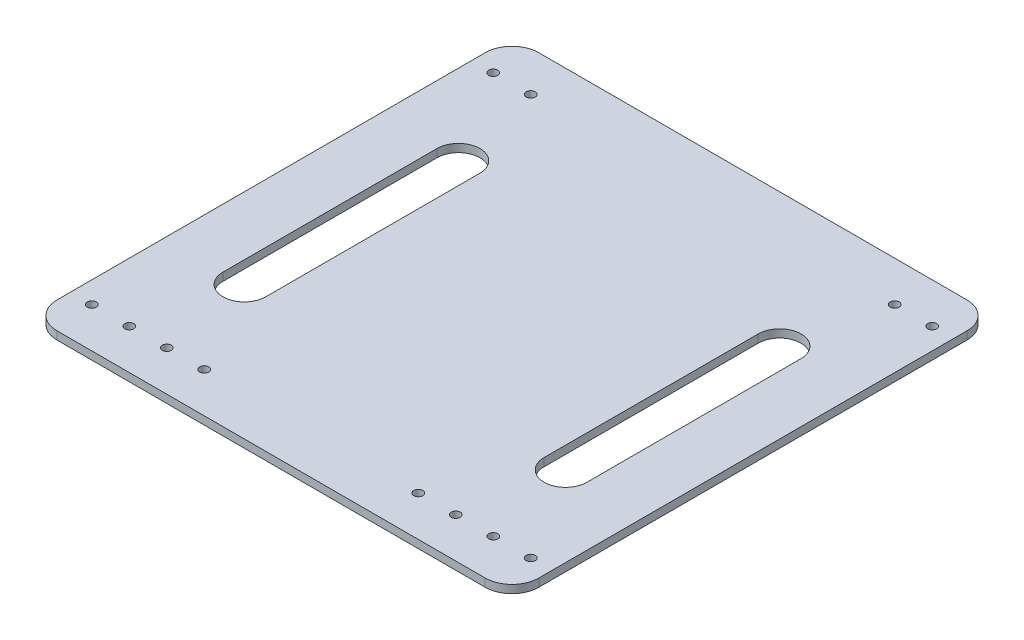
ISO-10303-21;
HEADER;
FILE_DESCRIPTION(('STEP AP214'),'2;1');
FILE_NAME('part.step','',(''),(''),'','','');
FILE_SCHEMA(('AUTOMOTIVE_DESIGN { 1 0 10303 214 1 1 1 1 }'));
ENDSEC;
DATA;
#1=APPLICATION_CONTEXT('core data for automotive mechanical design processes');
#2=APPLICATION_PROTOCOL_DEFINITION('international standard','automotive_design',2000,#1);
#3=PRODUCT_CONTEXT('',#1,'mechanical');
#4=PRODUCT('Part','Part','',(#3));
#5=PRODUCT_RELATED_PRODUCT_CATEGORY('part','',(#4));
#6=PRODUCT_DEFINITION_FORMATION('','',#4);
#7=PRODUCT_DEFINITION_CONTEXT('part definition',#1,'design');
#8=PRODUCT_DEFINITION('design','',#6,#7);
#9=PRODUCT_DEFINITION_SHAPE('','',#8);
#10=(LENGTH_UNIT() NAMED_UNIT(*) SI_UNIT(.MILLI.,.METRE.));
#11=(NAMED_UNIT(*) PLANE_ANGLE_UNIT() SI_UNIT($,.RADIAN.));
#12=(NAMED_UNIT(*) SI_UNIT($,.STERADIAN.) SOLID_ANGLE_UNIT());
#13=UNCERTAINTY_MEASURE_WITH_UNIT(LENGTH_MEASURE(1.E-05),#10,'distance_accuracy_value','');
#14=(GEOMETRIC_REPRESENTATION_CONTEXT(3) GLOBAL_UNCERTAINTY_ASSIGNED_CONTEXT((#13)) GLOBAL_UNIT_ASSIGNED_CONTEXT((#10,
#11,#12)) REPRESENTATION_CONTEXT('',''));
#15=CARTESIAN_POINT('',(0.,0.,0.));
#16=DIRECTION('',(0.,0.,1.));
#17=DIRECTION('',(1.,0.,0.));
#18=AXIS2_PLACEMENT_3D('',#15,#16,#17);
#19=CARTESIAN_POINT('',(90.,3.,-90.));
#20=DIRECTION('',(-1.,0.,0.));
#21=DIRECTION('',(0.,0.,1.));
#22=AXIS2_PLACEMENT_3D('',#19,#20,#21);
#23=PLANE('',#22);
#24=DIRECTION('',(0.,0.,-1.));
#25=VECTOR('',#24,1.);
#26=CARTESIAN_POINT('',(90.,0.,-90.));
#27=LINE('',#26,#25);
#28=CARTESIAN_POINT('',(90.,0.,79.9999999999999));
#29=VERTEX_POINT('',#28);
#30=CARTESIAN_POINT('',(90.,0.,-80.));
#31=VERTEX_POINT('',#30);
#32=EDGE_CURVE('E286',#29,#31,#27,.T.);
#33=ORIENTED_EDGE('',*,*,#32,.T.);
#34=DIRECTION('',(0.,-1.,0.));
#35=VECTOR('',#34,1.);
#36=CARTESIAN_POINT('',(90.,3.,-80.));
#37=LINE('',#36,#35);
#38=CARTESIAN_POINT('',(90.,3.,-80.));
#39=VERTEX_POINT('',#38);
#40=EDGE_CURVE('E11',#31,#39,#37,.F.);
#41=ORIENTED_EDGE('',*,*,#40,.T.);
#42=DIRECTION('',(0.,0.,-1.));
#43=VECTOR('',#42,1.);
#44=CARTESIAN_POINT('',(90.,3.,-90.));
#45=LINE('',#44,#43);
#46=CARTESIAN_POINT('',(90.,3.,79.9999999999999));
#47=VERTEX_POINT('',#46);
#48=EDGE_CURVE('E287',#47,#39,#45,.T.);
#49=ORIENTED_EDGE('',*,*,#48,.F.);
#50=DIRECTION('',(0.,-1.,0.));
#51=VECTOR('',#50,1.);
#52=CARTESIAN_POINT('',(90.,3.,80.));
#53=LINE('',#52,#51);
#54=EDGE_CURVE('E41',#47,#29,#53,.T.);
#55=ORIENTED_EDGE('',*,*,#54,.T.);
#56=EDGE_LOOP('',(#33,#41,#49,#55));
#57=FACE_BOUND('',#56,.T.);
#58=ADVANCED_FACE('F33',(#57),#23,.F.);
#59=CARTESIAN_POINT('',(-90.,3.,-90.));
#60=DIRECTION('',(0.,0.,1.));
#61=DIRECTION('',(1.,0.,0.));
#62=AXIS2_PLACEMENT_3D('',#59,#60,#61);
#63=PLANE('',#62);
#64=DIRECTION('',(-1.,0.,0.));
#65=VECTOR('',#64,1.);
#66=CARTESIAN_POINT('',(-90.,0.,-90.));
#67=LINE('',#66,#65);
#68=CARTESIAN_POINT('',(79.9999999999999,0.,-90.));
#69=VERTEX_POINT('',#68);
#70=CARTESIAN_POINT('',(-80.,0.,-90.));
#71=VERTEX_POINT('',#70);
#72=EDGE_CURVE('E303',#69,#71,#67,.T.);
#73=ORIENTED_EDGE('',*,*,#72,.T.);
#74=DIRECTION('',(0.,-1.,0.));
#75=VECTOR('',#74,1.);
#76=CARTESIAN_POINT('',(-80.,3.,-90.));
#77=LINE('',#76,#75);
#78=CARTESIAN_POINT('',(-80.,3.,-90.));
#79=VERTEX_POINT('',#78);
#80=EDGE_CURVE('E326',#71,#79,#77,.F.);
#81=ORIENTED_EDGE('',*,*,#80,.T.);
#82=DIRECTION('',(-1.,0.,0.));
#83=VECTOR('',#82,1.);
#84=CARTESIAN_POINT('',(-90.,3.,-90.));
#85=LINE('',#84,#83);
#86=CARTESIAN_POINT('',(79.9999999999999,3.,-90.));
#87=VERTEX_POINT('',#86);
#88=EDGE_CURVE('E290',#87,#79,#85,.T.);
#89=ORIENTED_EDGE('',*,*,#88,.F.);
#90=DIRECTION('',(0.,-1.,0.));
#91=VECTOR('',#90,1.);
#92=CARTESIAN_POINT('',(80.,3.,-90.));
#93=LINE('',#92,#91);
#94=EDGE_CURVE('E323',#87,#69,#93,.T.);
#95=ORIENTED_EDGE('',*,*,#94,.T.);
#96=EDGE_LOOP('',(#73,#81,#89,#95));
#97=FACE_BOUND('',#96,.T.);
#98=ADVANCED_FACE('F358',(#97),#63,.F.);
#99=CARTESIAN_POINT('',(-90.,3.,-90.));
#100=DIRECTION('',(1.,0.,0.));
#101=DIRECTION('',(0.,0.,-1.));
#102=AXIS2_PLACEMENT_3D('',#99,#100,#101);
#103=PLANE('',#102);
#104=DIRECTION('',(0.,0.,1.));
#105=VECTOR('',#104,1.);
#106=CARTESIAN_POINT('',(-90.,3.,-90.));
#107=LINE('',#106,#105);
#108=CARTESIAN_POINT('',(-90.,3.,-80.));
#109=VERTEX_POINT('',#108);
#110=CARTESIAN_POINT('',(-90.,3.,79.9999999999999));
#111=VERTEX_POINT('',#110);
#112=EDGE_CURVE('E294',#109,#111,#107,.T.);
#113=ORIENTED_EDGE('',*,*,#112,.F.);
#114=DIRECTION('',(0.,-1.,0.));
#115=VECTOR('',#114,1.);
#116=CARTESIAN_POINT('',(-90.,3.,-80.));
#117=LINE('',#116,#115);
#118=CARTESIAN_POINT('',(-90.,0.,-80.));
#119=VERTEX_POINT('',#118);
#120=EDGE_CURVE('E312',#109,#119,#117,.T.);
#121=ORIENTED_EDGE('',*,*,#120,.T.);
#122=DIRECTION('',(0.,0.,1.));
#123=VECTOR('',#122,1.);
#124=CARTESIAN_POINT('',(-90.,0.,-90.));
#125=LINE('',#124,#123);
#126=CARTESIAN_POINT('',(-90.,0.,79.9999999999999));
#127=VERTEX_POINT('',#126);
#128=EDGE_CURVE('E306',#119,#127,#125,.T.);
#129=ORIENTED_EDGE('',*,*,#128,.T.);
#130=DIRECTION('',(0.,-1.,0.));
#131=VECTOR('',#130,1.);
#132=CARTESIAN_POINT('',(-90.,3.,80.));
#133=LINE('',#132,#131);
#134=EDGE_CURVE('E300',#127,#111,#133,.F.);
#135=ORIENTED_EDGE('',*,*,#134,.T.);
#136=EDGE_LOOP('',(#113,#121,#129,#135));
#137=FACE_BOUND('',#136,.T.);
#138=ADVANCED_FACE('F368',(#137),#103,.F.);
#139=CARTESIAN_POINT('',(-90.,3.,90.));
#140=DIRECTION('',(0.,0.,-1.));
#141=DIRECTION('',(-1.,0.,0.));
#142=AXIS2_PLACEMENT_3D('',#139,#140,#141);
#143=PLANE('',#142);
#144=DIRECTION('',(1.,0.,0.));
#145=VECTOR('',#144,1.);
#146=CARTESIAN_POINT('',(-90.,3.,90.));
#147=LINE('',#146,#145);
#148=CARTESIAN_POINT('',(-80.,3.,90.));
#149=VERTEX_POINT('',#148);
#150=CARTESIAN_POINT('',(79.9999999999999,3.,90.));
#151=VERTEX_POINT('',#150);
#152=EDGE_CURVE('E297',#149,#151,#147,.T.);
#153=ORIENTED_EDGE('',*,*,#152,.F.);
#154=DIRECTION('',(0.,-1.,0.));
#155=VECTOR('',#154,1.);
#156=CARTESIAN_POINT('',(-80.,3.,90.));
#157=LINE('',#156,#155);
#158=CARTESIAN_POINT('',(-80.,0.,90.));
#159=VERTEX_POINT('',#158);
#160=EDGE_CURVE('E338',#149,#159,#157,.T.);
#161=ORIENTED_EDGE('',*,*,#160,.T.);
#162=DIRECTION('',(1.,0.,0.));
#163=VECTOR('',#162,1.);
#164=CARTESIAN_POINT('',(-90.,0.,90.));
#165=LINE('',#164,#163);
#166=CARTESIAN_POINT('',(79.9999999999999,0.,90.));
#167=VERTEX_POINT('',#166);
#168=EDGE_CURVE('E291',#159,#167,#165,.T.);
#169=ORIENTED_EDGE('',*,*,#168,.T.);
#170=DIRECTION('',(0.,-1.,0.));
#171=VECTOR('',#170,1.);
#172=CARTESIAN_POINT('',(80.,3.,90.));
#173=LINE('',#172,#171);
#174=EDGE_CURVE('E336',#167,#151,#173,.F.);
#175=ORIENTED_EDGE('',*,*,#174,.T.);
#176=EDGE_LOOP('',(#153,#161,#169,#175));
#177=FACE_BOUND('',#176,.T.);
#178=ADVANCED_FACE('F376',(#177),#143,.F.);
#179=CARTESIAN_POINT('',(0.,3.,0.));
#180=DIRECTION('',(0.,1.,0.));
#181=DIRECTION('',(0.,0.,1.));
#182=AXIS2_PLACEMENT_3D('',#179,#180,#181);
#183=PLANE('',#182);
#184=CARTESIAN_POINT('',(-60.,3.,-40.));
#185=DIRECTION('',(0.,1.,0.));
#186=DIRECTION('',(0.,0.,1.));
#187=AXIS2_PLACEMENT_3D('',#184,#185,#186);
#188=CIRCLE('',#187,8.);
#189=CARTESIAN_POINT('',(-52.,3.,-40.));
#190=VERTEX_POINT('',#189);
#191=CARTESIAN_POINT('',(-68.,3.,-40.));
#192=VERTEX_POINT('',#191);
#193=EDGE_CURVE('E48',#190,#192,#188,.T.);
#194=ORIENTED_EDGE('',*,*,#193,.F.);
#195=DIRECTION('',(0.,0.,-1.));
#196=VECTOR('',#195,1.);
#197=CARTESIAN_POINT('',(-52.,3.,-40.));
#198=LINE('',#197,#196);
#199=CARTESIAN_POINT('',(-52.,3.,40.));
#200=VERTEX_POINT('',#199);
#201=EDGE_CURVE('E166',#200,#190,#198,.T.);
#202=ORIENTED_EDGE('',*,*,#201,.F.);
#203=CARTESIAN_POINT('',(-60.,3.,40.));
#204=DIRECTION('',(0.,1.,0.));
#205=DIRECTION('',(0.,0.,1.));
#206=AXIS2_PLACEMENT_3D('',#203,#204,#205);
#207=CIRCLE('',#206,8.);
#208=CARTESIAN_POINT('',(-68.,3.,40.));
#209=VERTEX_POINT('',#208);
#210=EDGE_CURVE('E169',#209,#200,#207,.T.);
#211=ORIENTED_EDGE('',*,*,#210,.F.);
#212=DIRECTION('',(0.,0.,1.));
#213=VECTOR('',#212,1.);
#214=CARTESIAN_POINT('',(-68.,3.,-40.));
#215=LINE('',#214,#213);
#216=EDGE_CURVE('E175',#192,#209,#215,.T.);
#217=ORIENTED_EDGE('',*,*,#216,.F.);
#218=EDGE_LOOP('',(#194,#202,#211,#217));
#219=FACE_BOUND('',#218,.T.);
#220=CARTESIAN_POINT('',(60.,3.,-40.));
#221=DIRECTION('',(0.,1.,0.));
#222=DIRECTION('',(0.,0.,1.));
#223=AXIS2_PLACEMENT_3D('',#220,#221,#222);
#224=CIRCLE('',#223,8.00000000000001);
#225=CARTESIAN_POINT('',(68.,3.,-40.));
#226=VERTEX_POINT('',#225);
#227=CARTESIAN_POINT('',(52.,3.,-40.));
#228=VERTEX_POINT('',#227);
#229=EDGE_CURVE('E56',#226,#228,#224,.T.);
#230=ORIENTED_EDGE('',*,*,#229,.F.);
#231=DIRECTION('',(0.,0.,-1.));
#232=VECTOR('',#231,1.);
#233=CARTESIAN_POINT('',(68.,3.,-40.));
#234=LINE('',#233,#232);
#235=CARTESIAN_POINT('',(68.,3.,40.));
#236=VERTEX_POINT('',#235);
#237=EDGE_CURVE('E190',#236,#226,#234,.T.);
#238=ORIENTED_EDGE('',*,*,#237,.F.);
#239=CARTESIAN_POINT('',(60.,3.,40.));
#240=DIRECTION('',(0.,1.,0.));
#241=DIRECTION('',(0.,0.,1.));
#242=AXIS2_PLACEMENT_3D('',#239,#240,#241);
#243=CIRCLE('',#242,8.00000000000001);
#244=CARTESIAN_POINT('',(52.,3.,40.));
#245=VERTEX_POINT('',#244);
#246=EDGE_CURVE('E204',#245,#236,#243,.T.);
#247=ORIENTED_EDGE('',*,*,#246,.F.);
#248=DIRECTION('',(0.,0.,1.));
#249=VECTOR('',#248,1.);
#250=CARTESIAN_POINT('',(52.,3.,-40.));
#251=LINE('',#250,#249);
#252=EDGE_CURVE('E201',#228,#245,#251,.T.);
#253=ORIENTED_EDGE('',*,*,#252,.F.);
#254=EDGE_LOOP('',(#230,#238,#247,#253));
#255=FACE_BOUND('',#254,.T.);
#256=CARTESIAN_POINT('',(-68.,3.,75.));
#257=DIRECTION('',(0.,1.,0.));
#258=DIRECTION('',(0.,0.,1.));
#259=AXIS2_PLACEMENT_3D('',#256,#257,#258);
#260=CIRCLE('',#259,1.70000000000001);
#261=CARTESIAN_POINT('',(-68.,3.,76.7));
#262=VERTEX_POINT('',#261);
#263=EDGE_CURVE('E245',#262,#262,#260,.T.);
#264=ORIENTED_EDGE('',*,*,#263,.F.);
#265=EDGE_LOOP('',(#264));
#266=FACE_BOUND('',#265,.T.);
#267=CARTESIAN_POINT('',(68.,3.,75.));
#268=DIRECTION('',(0.,1.,0.));
#269=DIRECTION('',(0.,0.,1.));
#270=AXIS2_PLACEMENT_3D('',#267,#268,#269);
#271=CIRCLE('',#270,1.70000000000001);
#272=CARTESIAN_POINT('',(68.,3.,76.7));
#273=VERTEX_POINT('',#272);
#274=EDGE_CURVE('E240',#273,#273,#271,.T.);
#275=ORIENTED_EDGE('',*,*,#274,.F.);
#276=EDGE_LOOP('',(#275));
#277=FACE_BOUND('',#276,.T.);
#278=CARTESIAN_POINT('',(82.,3.,75.));
#279=DIRECTION('',(0.,1.,0.));
#280=DIRECTION('',(0.,0.,1.));
#281=AXIS2_PLACEMENT_3D('',#278,#279,#280);
#282=CIRCLE('',#281,1.70000000000001);
#283=CARTESIAN_POINT('',(82.,3.,76.7));
#284=VERTEX_POINT('',#283);
#285=EDGE_CURVE('E233',#284,#284,#282,.T.);
#286=ORIENTED_EDGE('',*,*,#285,.F.);
#287=EDGE_LOOP('',(#286));
#288=FACE_BOUND('',#287,.T.);
#289=CARTESIAN_POINT('',(-54.,3.,75.));
#290=DIRECTION('',(0.,1.,0.));
#291=DIRECTION('',(0.,0.,1.));
#292=AXIS2_PLACEMENT_3D('',#289,#290,#291);
#293=CIRCLE('',#292,1.7);
#294=CARTESIAN_POINT('',(-54.,3.,76.7));
#295=VERTEX_POINT('',#294);
#296=EDGE_CURVE('E228',#295,#295,#293,.T.);
#297=ORIENTED_EDGE('',*,*,#296,.F.);
#298=EDGE_LOOP('',(#297));
#299=FACE_BOUND('',#298,.T.);
#300=CARTESIAN_POINT('',(-68.,3.,-75.));
#301=DIRECTION('',(0.,1.,0.));
#302=DIRECTION('',(0.,0.,1.));
#303=AXIS2_PLACEMENT_3D('',#300,#301,#302);
#304=CIRCLE('',#303,1.70000000000001);
#305=CARTESIAN_POINT('',(-68.,3.,-73.3));
#306=VERTEX_POINT('',#305);
#307=EDGE_CURVE('E269',#306,#306,#304,.T.);
#308=ORIENTED_EDGE('',*,*,#307,.F.);
#309=EDGE_LOOP('',(#308));
#310=FACE_BOUND('',#309,.T.);
#311=CARTESIAN_POINT('',(68.,3.,-75.));
#312=DIRECTION('',(0.,1.,0.));
#313=DIRECTION('',(0.,0.,1.));
#314=AXIS2_PLACEMENT_3D('',#311,#312,#313);
#315=CIRCLE('',#314,1.70000000000001);
#316=CARTESIAN_POINT('',(68.,3.,-73.3));
#317=VERTEX_POINT('',#316);
#318=EDGE_CURVE('E264',#317,#317,#315,.T.);
#319=ORIENTED_EDGE('',*,*,#318,.F.);
#320=EDGE_LOOP('',(#319));
#321=FACE_BOUND('',#320,.T.);
#322=CARTESIAN_POINT('',(82.,3.,-75.));
#323=DIRECTION('',(0.,1.,0.));
#324=DIRECTION('',(0.,0.,1.));
#325=AXIS2_PLACEMENT_3D('',#322,#323,#324);
#326=CIRCLE('',#325,1.70000000000001);
#327=CARTESIAN_POINT('',(82.,3.,-73.3));
#328=VERTEX_POINT('',#327);
#329=EDGE_CURVE('E257',#328,#328,#326,.T.);
#330=ORIENTED_EDGE('',*,*,#329,.F.);
#331=EDGE_LOOP('',(#330));
#332=FACE_BOUND('',#331,.T.);
#333=CARTESIAN_POINT('',(-82.,3.,75.));
#334=DIRECTION('',(0.,1.,0.));
#335=DIRECTION('',(0.,0.,1.));
#336=AXIS2_PLACEMENT_3D('',#333,#334,#335);
#337=CIRCLE('',#336,1.70000000000001);
#338=CARTESIAN_POINT('',(-82.,3.,76.7));
#339=VERTEX_POINT('',#338);
#340=EDGE_CURVE('E252',#339,#339,#337,.T.);
#341=ORIENTED_EDGE('',*,*,#340,.F.);
#342=EDGE_LOOP('',(#341));
#343=FACE_BOUND('',#342,.T.);
#344=CARTESIAN_POINT('',(40.,3.,75.));
#345=DIRECTION('',(0.,1.,0.));
#346=DIRECTION('',(0.,0.,1.));
#347=AXIS2_PLACEMENT_3D('',#344,#345,#346);
#348=CIRCLE('',#347,1.7);
#349=CARTESIAN_POINT('',(40.,3.,76.7));
#350=VERTEX_POINT('',#349);
#351=EDGE_CURVE('E182',#350,#350,#348,.T.);
#352=ORIENTED_EDGE('',*,*,#351,.F.);
#353=EDGE_LOOP('',(#352));
#354=FACE_BOUND('',#353,.T.);
#355=CARTESIAN_POINT('',(-40.,3.,75.));
#356=DIRECTION('',(0.,1.,0.));
#357=DIRECTION('',(0.,0.,1.));
#358=AXIS2_PLACEMENT_3D('',#355,#356,#357);
#359=CIRCLE('',#358,1.7);
#360=CARTESIAN_POINT('',(-40.,3.,76.7));
#361=VERTEX_POINT('',#360);
#362=EDGE_CURVE('E220',#361,#361,#359,.T.);
#363=ORIENTED_EDGE('',*,*,#362,.F.);
#364=EDGE_LOOP('',(#363));
#365=FACE_BOUND('',#364,.T.);
#366=CARTESIAN_POINT('',(54.,3.,75.));
#367=DIRECTION('',(0.,1.,0.));
#368=DIRECTION('',(0.,0.,1.));
#369=AXIS2_PLACEMENT_3D('',#366,#367,#368);
#370=CIRCLE('',#369,1.7);
#371=CARTESIAN_POINT('',(54.,3.,76.7));
#372=VERTEX_POINT('',#371);
#373=EDGE_CURVE('E221',#372,#372,#370,.T.);
#374=ORIENTED_EDGE('',*,*,#373,.F.);
#375=EDGE_LOOP('',(#374));
#376=FACE_BOUND('',#375,.T.);
#377=CARTESIAN_POINT('',(-82.,3.,-75.));
#378=DIRECTION('',(0.,1.,0.));
#379=DIRECTION('',(0.,0.,1.));
#380=AXIS2_PLACEMENT_3D('',#377,#378,#379);
#381=CIRCLE('',#380,1.70000000000001);
#382=CARTESIAN_POINT('',(-82.,3.,-73.3));
#383=VERTEX_POINT('',#382);
#384=EDGE_CURVE('E276',#383,#383,#381,.T.);
#385=ORIENTED_EDGE('',*,*,#384,.F.);
#386=EDGE_LOOP('',(#385));
#387=FACE_BOUND('',#386,.T.);
#388=ORIENTED_EDGE('',*,*,#88,.T.);
#389=CARTESIAN_POINT('',(-80.,3.,-80.));
#390=DIRECTION('',(0.,1.,0.));
#391=DIRECTION('',(0.,0.,1.));
#392=AXIS2_PLACEMENT_3D('',#389,#390,#391);
#393=CIRCLE('',#392,10.);
#394=EDGE_CURVE('E334',#79,#109,#393,.T.);
#395=ORIENTED_EDGE('',*,*,#394,.T.);
#396=ORIENTED_EDGE('',*,*,#112,.T.);
#397=CARTESIAN_POINT('',(-80.,3.,80.));
#398=DIRECTION('',(0.,1.,0.));
#399=DIRECTION('',(0.,0.,1.));
#400=AXIS2_PLACEMENT_3D('',#397,#398,#399);
#401=CIRCLE('',#400,10.);
#402=EDGE_CURVE('E332',#111,#149,#401,.T.);
#403=ORIENTED_EDGE('',*,*,#402,.T.);
#404=ORIENTED_EDGE('',*,*,#152,.T.);
#405=CARTESIAN_POINT('',(80.,3.,80.));
#406=DIRECTION('',(0.,1.,0.));
#407=DIRECTION('',(0.,0.,1.));
#408=AXIS2_PLACEMENT_3D('',#405,#406,#407);
#409=CIRCLE('',#408,10.);
#410=EDGE_CURVE('E328',#151,#47,#409,.T.);
#411=ORIENTED_EDGE('',*,*,#410,.T.);
#412=ORIENTED_EDGE('',*,*,#48,.T.);
#413=CARTESIAN_POINT('',(80.,3.,-80.));
#414=DIRECTION('',(0.,1.,0.));
#415=DIRECTION('',(0.,0.,1.));
#416=AXIS2_PLACEMENT_3D('',#413,#414,#415);
#417=CIRCLE('',#416,10.);
#418=EDGE_CURVE('E330',#39,#87,#417,.T.);
#419=ORIENTED_EDGE('',*,*,#418,.T.);
#420=EDGE_LOOP('',(#388,#395,#396,#403,#404,#411,#412,#419));
#421=FACE_BOUND('',#420,.T.);
#422=ADVANCED_FACE('F362',(#219,#255,#266,#277,#288,#299,#310,#321,#332,#343,#354,#365,#376,
#387,#421),#183,.T.);
#423=CARTESIAN_POINT('',(0.,0.,0.));
#424=DIRECTION('',(0.,1.,0.));
#425=DIRECTION('',(0.,0.,1.));
#426=AXIS2_PLACEMENT_3D('',#423,#424,#425);
#427=PLANE('',#426);
#428=DIRECTION('',(0.,0.,-1.));
#429=VECTOR('',#428,1.);
#430=CARTESIAN_POINT('',(-52.,0.,-40.));
#431=LINE('',#430,#429);
#432=CARTESIAN_POINT('',(-52.,0.,40.));
#433=VERTEX_POINT('',#432);
#434=CARTESIAN_POINT('',(-52.,0.,-40.));
#435=VERTEX_POINT('',#434);
#436=EDGE_CURVE('E153',#433,#435,#431,.T.);
#437=ORIENTED_EDGE('',*,*,#436,.T.);
#438=CARTESIAN_POINT('',(-60.,0.,-40.));
#439=DIRECTION('',(0.,1.,0.));
#440=DIRECTION('',(0.,0.,1.));
#441=AXIS2_PLACEMENT_3D('',#438,#439,#440);
#442=CIRCLE('',#441,8.);
#443=CARTESIAN_POINT('',(-68.,0.,-40.));
#444=VERTEX_POINT('',#443);
#445=EDGE_CURVE('E147',#435,#444,#442,.T.);
#446=ORIENTED_EDGE('',*,*,#445,.T.);
#447=DIRECTION('',(0.,0.,1.));
#448=VECTOR('',#447,1.);
#449=CARTESIAN_POINT('',(-68.,0.,-40.));
#450=LINE('',#449,#448);
#451=CARTESIAN_POINT('',(-68.,0.,40.));
#452=VERTEX_POINT('',#451);
#453=EDGE_CURVE('E157',#444,#452,#450,.T.);
#454=ORIENTED_EDGE('',*,*,#453,.T.);
#455=CARTESIAN_POINT('',(-60.,0.,40.));
#456=DIRECTION('',(0.,1.,0.));
#457=DIRECTION('',(0.,0.,1.));
#458=AXIS2_PLACEMENT_3D('',#455,#456,#457);
#459=CIRCLE('',#458,8.);
#460=EDGE_CURVE('E161',#452,#433,#459,.T.);
#461=ORIENTED_EDGE('',*,*,#460,.T.);
#462=EDGE_LOOP('',(#437,#446,#454,#461));
#463=FACE_BOUND('',#462,.T.);
#464=DIRECTION('',(0.,0.,-1.));
#465=VECTOR('',#464,1.);
#466=CARTESIAN_POINT('',(68.,0.,-40.));
#467=LINE('',#466,#465);
#468=CARTESIAN_POINT('',(68.,0.,40.));
#469=VERTEX_POINT('',#468);
#470=CARTESIAN_POINT('',(68.,0.,-40.));
#471=VERTEX_POINT('',#470);
#472=EDGE_CURVE('E196',#469,#471,#467,.T.);
#473=ORIENTED_EDGE('',*,*,#472,.T.);
#474=CARTESIAN_POINT('',(60.,0.,-40.));
#475=DIRECTION('',(0.,1.,0.));
#476=DIRECTION('',(0.,0.,1.));
#477=AXIS2_PLACEMENT_3D('',#474,#475,#476);
#478=CIRCLE('',#477,8.00000000000001);
#479=CARTESIAN_POINT('',(52.,0.,-40.));
#480=VERTEX_POINT('',#479);
#481=EDGE_CURVE('E186',#471,#480,#478,.T.);
#482=ORIENTED_EDGE('',*,*,#481,.T.);
#483=DIRECTION('',(0.,0.,1.));
#484=VECTOR('',#483,1.);
#485=CARTESIAN_POINT('',(52.,0.,-40.));
#486=LINE('',#485,#484);
#487=CARTESIAN_POINT('',(52.,0.,40.));
#488=VERTEX_POINT('',#487);
#489=EDGE_CURVE('E189',#480,#488,#486,.T.);
#490=ORIENTED_EDGE('',*,*,#489,.T.);
#491=CARTESIAN_POINT('',(60.,0.,40.));
#492=DIRECTION('',(0.,1.,0.));
#493=DIRECTION('',(0.,0.,1.));
#494=AXIS2_PLACEMENT_3D('',#491,#492,#493);
#495=CIRCLE('',#494,8.00000000000001);
#496=EDGE_CURVE('E193',#488,#469,#495,.T.);
#497=ORIENTED_EDGE('',*,*,#496,.T.);
#498=EDGE_LOOP('',(#473,#482,#490,#497));
#499=FACE_BOUND('',#498,.T.);
#500=CARTESIAN_POINT('',(-68.,0.,75.));
#501=DIRECTION('',(0.,1.,0.));
#502=DIRECTION('',(0.,0.,1.));
#503=AXIS2_PLACEMENT_3D('',#500,#501,#502);
#504=CIRCLE('',#503,1.70000000000001);
#505=CARTESIAN_POINT('',(-68.,0.,76.7));
#506=VERTEX_POINT('',#505);
#507=EDGE_CURVE('E248',#506,#506,#504,.F.);
#508=ORIENTED_EDGE('',*,*,#507,.F.);
#509=EDGE_LOOP('',(#508));
#510=FACE_BOUND('',#509,.T.);
#511=CARTESIAN_POINT('',(68.,0.,75.));
#512=DIRECTION('',(0.,1.,0.));
#513=DIRECTION('',(0.,0.,1.));
#514=AXIS2_PLACEMENT_3D('',#511,#512,#513);
#515=CIRCLE('',#514,1.70000000000001);
#516=CARTESIAN_POINT('',(68.,0.,76.7));
#517=VERTEX_POINT('',#516);
#518=EDGE_CURVE('E249',#517,#517,#515,.F.);
#519=ORIENTED_EDGE('',*,*,#518,.F.);
#520=EDGE_LOOP('',(#519));
#521=FACE_BOUND('',#520,.T.);
#522=CARTESIAN_POINT('',(82.,0.,75.));
#523=DIRECTION('',(0.,1.,0.));
#524=DIRECTION('',(0.,0.,1.));
#525=AXIS2_PLACEMENT_3D('',#522,#523,#524);
#526=CIRCLE('',#525,1.70000000000001);
#527=CARTESIAN_POINT('',(82.,0.,76.7));
#528=VERTEX_POINT('',#527);
#529=EDGE_CURVE('E236',#528,#528,#526,.F.);
#530=ORIENTED_EDGE('',*,*,#529,.F.);
#531=EDGE_LOOP('',(#530));
#532=FACE_BOUND('',#531,.T.);
#533=CARTESIAN_POINT('',(-54.,0.,75.));
#534=DIRECTION('',(0.,1.,0.));
#535=DIRECTION('',(0.,0.,1.));
#536=AXIS2_PLACEMENT_3D('',#533,#534,#535);
#537=CIRCLE('',#536,1.7);
#538=CARTESIAN_POINT('',(-54.,0.,76.7));
#539=VERTEX_POINT('',#538);
#540=EDGE_CURVE('E237',#539,#539,#537,.F.);
#541=ORIENTED_EDGE('',*,*,#540,.F.);
#542=EDGE_LOOP('',(#541));
#543=FACE_BOUND('',#542,.T.);
#544=CARTESIAN_POINT('',(-68.,0.,-75.));
#545=DIRECTION('',(0.,1.,0.));
#546=DIRECTION('',(0.,0.,1.));
#547=AXIS2_PLACEMENT_3D('',#544,#545,#546);
#548=CIRCLE('',#547,1.70000000000001);
#549=CARTESIAN_POINT('',(-68.,0.,-73.3));
#550=VERTEX_POINT('',#549);
#551=EDGE_CURVE('E272',#550,#550,#548,.F.);
#552=ORIENTED_EDGE('',*,*,#551,.F.);
#553=EDGE_LOOP('',(#552));
#554=FACE_BOUND('',#553,.T.);
#555=CARTESIAN_POINT('',(68.,0.,-75.));
#556=DIRECTION('',(0.,1.,0.));
#557=DIRECTION('',(0.,0.,1.));
#558=AXIS2_PLACEMENT_3D('',#555,#556,#557);
#559=CIRCLE('',#558,1.70000000000001);
#560=CARTESIAN_POINT('',(68.,0.,-73.3));
#561=VERTEX_POINT('',#560);
#562=EDGE_CURVE('E273',#561,#561,#559,.F.);
#563=ORIENTED_EDGE('',*,*,#562,.F.);
#564=EDGE_LOOP('',(#563));
#565=FACE_BOUND('',#564,.T.);
#566=CARTESIAN_POINT('',(82.,0.,-75.));
#567=DIRECTION('',(0.,1.,0.));
#568=DIRECTION('',(0.,0.,1.));
#569=AXIS2_PLACEMENT_3D('',#566,#567,#568);
#570=CIRCLE('',#569,1.70000000000001);
#571=CARTESIAN_POINT('',(82.,0.,-73.3));
#572=VERTEX_POINT('',#571);
#573=EDGE_CURVE('E260',#572,#572,#570,.F.);
#574=ORIENTED_EDGE('',*,*,#573,.F.);
#575=EDGE_LOOP('',(#574));
#576=FACE_BOUND('',#575,.T.);
#577=CARTESIAN_POINT('',(-82.,0.,75.));
#578=DIRECTION('',(0.,1.,0.));
#579=DIRECTION('',(0.,0.,1.));
#580=AXIS2_PLACEMENT_3D('',#577,#578,#579);
#581=CIRCLE('',#580,1.70000000000001);
#582=CARTESIAN_POINT('',(-82.,0.,76.7));
#583=VERTEX_POINT('',#582);
#584=EDGE_CURVE('E261',#583,#583,#581,.F.);
#585=ORIENTED_EDGE('',*,*,#584,.F.);
#586=EDGE_LOOP('',(#585));
#587=FACE_BOUND('',#586,.T.);
#588=CARTESIAN_POINT('',(40.,0.,75.));
#589=DIRECTION('',(0.,1.,0.));
#590=DIRECTION('',(0.,0.,1.));
#591=AXIS2_PLACEMENT_3D('',#588,#589,#590);
#592=CIRCLE('',#591,1.7);
#593=CARTESIAN_POINT('',(40.,0.,76.7));
#594=VERTEX_POINT('',#593);
#595=EDGE_CURVE('E217',#594,#594,#592,.F.);
#596=ORIENTED_EDGE('',*,*,#595,.F.);
#597=EDGE_LOOP('',(#596));
#598=FACE_BOUND('',#597,.T.);
#599=CARTESIAN_POINT('',(-40.,0.,75.));
#600=DIRECTION('',(0.,1.,0.));
#601=DIRECTION('',(0.,0.,1.));
#602=AXIS2_PLACEMENT_3D('',#599,#600,#601);
#603=CIRCLE('',#602,1.7);
#604=CARTESIAN_POINT('',(-40.,0.,76.7));
#605=VERTEX_POINT('',#604);
#606=EDGE_CURVE('E225',#605,#605,#603,.F.);
#607=ORIENTED_EDGE('',*,*,#606,.F.);
#608=EDGE_LOOP('',(#607));
#609=FACE_BOUND('',#608,.T.);
#610=CARTESIAN_POINT('',(54.,0.,75.));
#611=DIRECTION('',(0.,1.,0.));
#612=DIRECTION('',(0.,0.,1.));
#613=AXIS2_PLACEMENT_3D('',#610,#611,#612);
#614=CIRCLE('',#613,1.7);
#615=CARTESIAN_POINT('',(54.,0.,76.7));
#616=VERTEX_POINT('',#615);
#617=EDGE_CURVE('E224',#616,#616,#614,.F.);
#618=ORIENTED_EDGE('',*,*,#617,.F.);
#619=EDGE_LOOP('',(#618));
#620=FACE_BOUND('',#619,.T.);
#621=CARTESIAN_POINT('',(-82.,0.,-75.));
#622=DIRECTION('',(0.,1.,0.));
#623=DIRECTION('',(0.,0.,1.));
#624=AXIS2_PLACEMENT_3D('',#621,#622,#623);
#625=CIRCLE('',#624,1.70000000000001);
#626=CARTESIAN_POINT('',(-82.,0.,-73.3));
#627=VERTEX_POINT('',#626);
#628=EDGE_CURVE('E283',#627,#627,#625,.F.);
#629=ORIENTED_EDGE('',*,*,#628,.F.);
#630=EDGE_LOOP('',(#629));
#631=FACE_BOUND('',#630,.T.);
#632=ORIENTED_EDGE('',*,*,#128,.F.);
#633=CARTESIAN_POINT('',(-80.,0.,-80.));
#634=DIRECTION('',(0.,1.,0.));
#635=DIRECTION('',(0.,0.,1.));
#636=AXIS2_PLACEMENT_3D('',#633,#634,#635);
#637=CIRCLE('',#636,10.);
#638=EDGE_CURVE('E321',#119,#71,#637,.F.);
#639=ORIENTED_EDGE('',*,*,#638,.T.);
#640=ORIENTED_EDGE('',*,*,#72,.F.);
#641=CARTESIAN_POINT('',(80.,0.,-80.));
#642=DIRECTION('',(0.,1.,0.));
#643=DIRECTION('',(0.,0.,1.));
#644=AXIS2_PLACEMENT_3D('',#641,#642,#643);
#645=CIRCLE('',#644,10.);
#646=EDGE_CURVE('E317',#69,#31,#645,.F.);
#647=ORIENTED_EDGE('',*,*,#646,.T.);
#648=ORIENTED_EDGE('',*,*,#32,.F.);
#649=CARTESIAN_POINT('',(80.,0.,80.));
#650=DIRECTION('',(0.,1.,0.));
#651=DIRECTION('',(0.,0.,1.));
#652=AXIS2_PLACEMENT_3D('',#649,#650,#651);
#653=CIRCLE('',#652,10.);
#654=EDGE_CURVE('E315',#29,#167,#653,.F.);
#655=ORIENTED_EDGE('',*,*,#654,.T.);
#656=ORIENTED_EDGE('',*,*,#168,.F.);
#657=CARTESIAN_POINT('',(-80.,0.,80.));
#658=DIRECTION('',(0.,1.,0.));
#659=DIRECTION('',(0.,0.,1.));
#660=AXIS2_PLACEMENT_3D('',#657,#658,#659);
#661=CIRCLE('',#660,10.);
#662=EDGE_CURVE('E319',#159,#127,#661,.F.);
#663=ORIENTED_EDGE('',*,*,#662,.T.);
#664=EDGE_LOOP('',(#632,#639,#640,#647,#648,#655,#656,#663));
#665=FACE_BOUND('',#664,.T.);
#666=ADVANCED_FACE('F163',(#463,#499,#510,#521,#532,#543,#554,#565,#576,#587,#598,#609,#620,
#631,#665),#427,.F.);
#667=CARTESIAN_POINT('',(-80.,3.,-80.));
#668=DIRECTION('',(0.,-1.,0.));
#669=DIRECTION('',(0.,0.,-1.));
#670=AXIS2_PLACEMENT_3D('',#667,#668,#669);
#671=CYLINDRICAL_SURFACE('',#670,10.);
#672=ORIENTED_EDGE('',*,*,#394,.F.);
#673=ORIENTED_EDGE('',*,*,#80,.F.);
#674=ORIENTED_EDGE('',*,*,#638,.F.);
#675=ORIENTED_EDGE('',*,*,#120,.F.);
#676=EDGE_LOOP('',(#672,#673,#674,#675));
#677=FACE_BOUND('',#676,.T.);
#678=ADVANCED_FACE('F366',(#677),#671,.T.);
#679=CARTESIAN_POINT('',(-80.,3.,80.));
#680=DIRECTION('',(0.,-1.,0.));
#681=DIRECTION('',(0.,0.,-1.));
#682=AXIS2_PLACEMENT_3D('',#679,#680,#681);
#683=CYLINDRICAL_SURFACE('',#682,10.);
#684=ORIENTED_EDGE('',*,*,#402,.F.);
#685=ORIENTED_EDGE('',*,*,#134,.F.);
#686=ORIENTED_EDGE('',*,*,#662,.F.);
#687=ORIENTED_EDGE('',*,*,#160,.F.);
#688=EDGE_LOOP('',(#684,#685,#686,#687));
#689=FACE_BOUND('',#688,.T.);
#690=ADVANCED_FACE('F373',(#689),#683,.T.);
#691=CARTESIAN_POINT('',(80.,3.,-80.));
#692=DIRECTION('',(0.,-1.,0.));
#693=DIRECTION('',(0.,0.,-1.));
#694=AXIS2_PLACEMENT_3D('',#691,#692,#693);
#695=CYLINDRICAL_SURFACE('',#694,10.);
#696=ORIENTED_EDGE('',*,*,#418,.F.);
#697=ORIENTED_EDGE('',*,*,#40,.F.);
#698=ORIENTED_EDGE('',*,*,#646,.F.);
#699=ORIENTED_EDGE('',*,*,#94,.F.);
#700=EDGE_LOOP('',(#696,#697,#698,#699));
#701=FACE_BOUND('',#700,.T.);
#702=ADVANCED_FACE('F355',(#701),#695,.T.);
#703=CARTESIAN_POINT('',(80.,3.,80.));
#704=DIRECTION('',(0.,-1.,0.));
#705=DIRECTION('',(0.,0.,-1.));
#706=AXIS2_PLACEMENT_3D('',#703,#704,#705);
#707=CYLINDRICAL_SURFACE('',#706,10.);
#708=ORIENTED_EDGE('',*,*,#410,.F.);
#709=ORIENTED_EDGE('',*,*,#174,.F.);
#710=ORIENTED_EDGE('',*,*,#654,.F.);
#711=ORIENTED_EDGE('',*,*,#54,.F.);
#712=EDGE_LOOP('',(#708,#709,#710,#711));
#713=FACE_BOUND('',#712,.T.);
#714=ADVANCED_FACE('F35',(#713),#707,.T.);
#715=CARTESIAN_POINT('',(-82.,-4.80832611206858,-75.));
#716=DIRECTION('',(0.,1.,0.));
#717=DIRECTION('',(0.,0.,1.));
#718=AXIS2_PLACEMENT_3D('',#715,#716,#717);
#719=CYLINDRICAL_SURFACE('',#718,1.70000000000001);
#720=ORIENTED_EDGE('',*,*,#628,.T.);
#721=EDGE_LOOP('',(#720));
#722=FACE_BOUND('',#721,.T.);
#723=ORIENTED_EDGE('',*,*,#384,.T.);
#724=EDGE_LOOP('',(#723));
#725=FACE_BOUND('',#724,.T.);
#726=ADVANCED_FACE('F379',(#722,#725),#719,.F.);
#727=CARTESIAN_POINT('',(54.,-4.80832611206858,75.));
#728=DIRECTION('',(0.,1.,0.));
#729=DIRECTION('',(0.,0.,1.));
#730=AXIS2_PLACEMENT_3D('',#727,#728,#729);
#731=CYLINDRICAL_SURFACE('',#730,1.7);
#732=ORIENTED_EDGE('',*,*,#617,.T.);
#733=EDGE_LOOP('',(#732));
#734=FACE_BOUND('',#733,.T.);
#735=ORIENTED_EDGE('',*,*,#373,.T.);
#736=EDGE_LOOP('',(#735));
#737=FACE_BOUND('',#736,.T.);
#738=ADVANCED_FACE('F384',(#734,#737),#731,.F.);
#739=CARTESIAN_POINT('',(-40.,-4.80832611206858,75.));
#740=DIRECTION('',(0.,1.,0.));
#741=DIRECTION('',(0.,0.,1.));
#742=AXIS2_PLACEMENT_3D('',#739,#740,#741);
#743=CYLINDRICAL_SURFACE('',#742,1.7);
#744=ORIENTED_EDGE('',*,*,#606,.T.);
#745=EDGE_LOOP('',(#744));
#746=FACE_BOUND('',#745,.T.);
#747=ORIENTED_EDGE('',*,*,#362,.T.);
#748=EDGE_LOOP('',(#747));
#749=FACE_BOUND('',#748,.T.);
#750=ADVANCED_FACE('F426',(#746,#749),#743,.F.);
#751=CARTESIAN_POINT('',(40.,-4.80832611206858,75.));
#752=DIRECTION('',(0.,1.,0.));
#753=DIRECTION('',(0.,0.,1.));
#754=AXIS2_PLACEMENT_3D('',#751,#752,#753);
#755=CYLINDRICAL_SURFACE('',#754,1.7);
#756=ORIENTED_EDGE('',*,*,#595,.T.);
#757=EDGE_LOOP('',(#756));
#758=FACE_BOUND('',#757,.T.);
#759=ORIENTED_EDGE('',*,*,#351,.T.);
#760=EDGE_LOOP('',(#759));
#761=FACE_BOUND('',#760,.T.);
#762=ADVANCED_FACE('F436',(#758,#761),#755,.F.);
#763=CARTESIAN_POINT('',(-82.,-4.80832611206858,75.));
#764=DIRECTION('',(0.,1.,0.));
#765=DIRECTION('',(0.,0.,1.));
#766=AXIS2_PLACEMENT_3D('',#763,#764,#765);
#767=CYLINDRICAL_SURFACE('',#766,1.70000000000001);
#768=ORIENTED_EDGE('',*,*,#584,.T.);
#769=EDGE_LOOP('',(#768));
#770=FACE_BOUND('',#769,.T.);
#771=ORIENTED_EDGE('',*,*,#340,.T.);
#772=EDGE_LOOP('',(#771));
#773=FACE_BOUND('',#772,.T.);
#774=ADVANCED_FACE('F446',(#770,#773),#767,.F.);
#775=CARTESIAN_POINT('',(82.,-4.80832611206858,-75.));
#776=DIRECTION('',(0.,1.,0.));
#777=DIRECTION('',(0.,0.,1.));
#778=AXIS2_PLACEMENT_3D('',#775,#776,#777);
#779=CYLINDRICAL_SURFACE('',#778,1.70000000000001);
#780=ORIENTED_EDGE('',*,*,#573,.T.);
#781=EDGE_LOOP('',(#780));
#782=FACE_BOUND('',#781,.T.);
#783=ORIENTED_EDGE('',*,*,#329,.T.);
#784=EDGE_LOOP('',(#783));
#785=FACE_BOUND('',#784,.T.);
#786=ADVANCED_FACE('F456',(#782,#785),#779,.F.);
#787=CARTESIAN_POINT('',(68.,-4.80832611206858,-75.));
#788=DIRECTION('',(0.,1.,0.));
#789=DIRECTION('',(0.,0.,1.));
#790=AXIS2_PLACEMENT_3D('',#787,#788,#789);
#791=CYLINDRICAL_SURFACE('',#790,1.70000000000001);
#792=ORIENTED_EDGE('',*,*,#562,.T.);
#793=EDGE_LOOP('',(#792));
#794=FACE_BOUND('',#793,.T.);
#795=ORIENTED_EDGE('',*,*,#318,.T.);
#796=EDGE_LOOP('',(#795));
#797=FACE_BOUND('',#796,.T.);
#798=ADVANCED_FACE('F466',(#794,#797),#791,.F.);
#799=CARTESIAN_POINT('',(-68.,-4.80832611206858,-75.));
#800=DIRECTION('',(0.,1.,0.));
#801=DIRECTION('',(0.,0.,1.));
#802=AXIS2_PLACEMENT_3D('',#799,#800,#801);
#803=CYLINDRICAL_SURFACE('',#802,1.70000000000001);
#804=ORIENTED_EDGE('',*,*,#551,.T.);
#805=EDGE_LOOP('',(#804));
#806=FACE_BOUND('',#805,.T.);
#807=ORIENTED_EDGE('',*,*,#307,.T.);
#808=EDGE_LOOP('',(#807));
#809=FACE_BOUND('',#808,.T.);
#810=ADVANCED_FACE('F476',(#806,#809),#803,.F.);
#811=CARTESIAN_POINT('',(-54.,-4.80832611206858,75.));
#812=DIRECTION('',(0.,1.,0.));
#813=DIRECTION('',(0.,0.,1.));
#814=AXIS2_PLACEMENT_3D('',#811,#812,#813);
#815=CYLINDRICAL_SURFACE('',#814,1.7);
#816=ORIENTED_EDGE('',*,*,#540,.T.);
#817=EDGE_LOOP('',(#816));
#818=FACE_BOUND('',#817,.T.);
#819=ORIENTED_EDGE('',*,*,#296,.T.);
#820=EDGE_LOOP('',(#819));
#821=FACE_BOUND('',#820,.T.);
#822=ADVANCED_FACE('F486',(#818,#821),#815,.F.);
#823=CARTESIAN_POINT('',(82.,-4.80832611206858,75.));
#824=DIRECTION('',(0.,1.,0.));
#825=DIRECTION('',(0.,0.,1.));
#826=AXIS2_PLACEMENT_3D('',#823,#824,#825);
#827=CYLINDRICAL_SURFACE('',#826,1.70000000000001);
#828=ORIENTED_EDGE('',*,*,#529,.T.);
#829=EDGE_LOOP('',(#828));
#830=FACE_BOUND('',#829,.T.);
#831=ORIENTED_EDGE('',*,*,#285,.T.);
#832=EDGE_LOOP('',(#831));
#833=FACE_BOUND('',#832,.T.);
#834=ADVANCED_FACE('F496',(#830,#833),#827,.F.);
#835=CARTESIAN_POINT('',(68.,-4.80832611206858,75.));
#836=DIRECTION('',(0.,1.,0.));
#837=DIRECTION('',(0.,0.,1.));
#838=AXIS2_PLACEMENT_3D('',#835,#836,#837);
#839=CYLINDRICAL_SURFACE('',#838,1.70000000000001);
#840=ORIENTED_EDGE('',*,*,#518,.T.);
#841=EDGE_LOOP('',(#840));
#842=FACE_BOUND('',#841,.T.);
#843=ORIENTED_EDGE('',*,*,#274,.T.);
#844=EDGE_LOOP('',(#843));
#845=FACE_BOUND('',#844,.T.);
#846=ADVANCED_FACE('F506',(#842,#845),#839,.F.);
#847=CARTESIAN_POINT('',(-68.,-4.80832611206858,75.));
#848=DIRECTION('',(0.,1.,0.));
#849=DIRECTION('',(0.,0.,1.));
#850=AXIS2_PLACEMENT_3D('',#847,#848,#849);
#851=CYLINDRICAL_SURFACE('',#850,1.70000000000001);
#852=ORIENTED_EDGE('',*,*,#507,.T.);
#853=EDGE_LOOP('',(#852));
#854=FACE_BOUND('',#853,.T.);
#855=ORIENTED_EDGE('',*,*,#263,.T.);
#856=EDGE_LOOP('',(#855));
#857=FACE_BOUND('',#856,.T.);
#858=ADVANCED_FACE('F516',(#854,#857),#851,.F.);
#859=CARTESIAN_POINT('',(60.,0.,-40.));
#860=DIRECTION('',(0.,1.,0.));
#861=DIRECTION('',(0.,0.,1.));
#862=AXIS2_PLACEMENT_3D('',#859,#860,#861);
#863=CYLINDRICAL_SURFACE('',#862,8.00000000000001);
#864=ORIENTED_EDGE('',*,*,#229,.T.);
#865=DIRECTION('',(0.,1.,0.));
#866=VECTOR('',#865,1.);
#867=CARTESIAN_POINT('',(52.,0.,-40.));
#868=LINE('',#867,#866);
#869=EDGE_CURVE('E199',#480,#228,#868,.T.);
#870=ORIENTED_EDGE('',*,*,#869,.F.);
#871=ORIENTED_EDGE('',*,*,#481,.F.);
#872=DIRECTION('',(0.,1.,0.));
#873=VECTOR('',#872,1.);
#874=CARTESIAN_POINT('',(68.,0.,-40.));
#875=LINE('',#874,#873);
#876=EDGE_CURVE('E176',#471,#226,#875,.T.);
#877=ORIENTED_EDGE('',*,*,#876,.T.);
#878=EDGE_LOOP('',(#864,#870,#871,#877));
#879=FACE_BOUND('',#878,.T.);
#880=ADVANCED_FACE('F526',(#879),#863,.F.);
#881=CARTESIAN_POINT('',(68.,0.,-40.));
#882=DIRECTION('',(1.,0.,0.));
#883=DIRECTION('',(0.,0.,-1.));
#884=AXIS2_PLACEMENT_3D('',#881,#882,#883);
#885=PLANE('',#884);
#886=ORIENTED_EDGE('',*,*,#237,.T.);
#887=ORIENTED_EDGE('',*,*,#876,.F.);
#888=ORIENTED_EDGE('',*,*,#472,.F.);
#889=DIRECTION('',(0.,1.,0.));
#890=VECTOR('',#889,1.);
#891=CARTESIAN_POINT('',(68.,0.,40.));
#892=LINE('',#891,#890);
#893=EDGE_CURVE('E210',#469,#236,#892,.T.);
#894=ORIENTED_EDGE('',*,*,#893,.T.);
#895=EDGE_LOOP('',(#886,#887,#888,#894));
#896=FACE_BOUND('',#895,.T.);
#897=ADVANCED_FACE('F555',(#896),#885,.F.);
#898=CARTESIAN_POINT('',(60.,0.,40.));
#899=DIRECTION('',(0.,1.,0.));
#900=DIRECTION('',(0.,0.,1.));
#901=AXIS2_PLACEMENT_3D('',#898,#899,#900);
#902=CYLINDRICAL_SURFACE('',#901,8.00000000000001);
#903=ORIENTED_EDGE('',*,*,#246,.T.);
#904=ORIENTED_EDGE('',*,*,#893,.F.);
#905=ORIENTED_EDGE('',*,*,#496,.F.);
#906=DIRECTION('',(0.,1.,0.));
#907=VECTOR('',#906,1.);
#908=CARTESIAN_POINT('',(52.,0.,40.));
#909=LINE('',#908,#907);
#910=EDGE_CURVE('E212',#488,#245,#909,.T.);
#911=ORIENTED_EDGE('',*,*,#910,.T.);
#912=EDGE_LOOP('',(#903,#904,#905,#911));
#913=FACE_BOUND('',#912,.T.);
#914=ADVANCED_FACE('F564',(#913),#902,.F.);
#915=CARTESIAN_POINT('',(52.,0.,-40.));
#916=DIRECTION('',(-1.,0.,0.));
#917=DIRECTION('',(0.,0.,1.));
#918=AXIS2_PLACEMENT_3D('',#915,#916,#917);
#919=PLANE('',#918);
#920=ORIENTED_EDGE('',*,*,#252,.T.);
#921=ORIENTED_EDGE('',*,*,#910,.F.);
#922=ORIENTED_EDGE('',*,*,#489,.F.);
#923=ORIENTED_EDGE('',*,*,#869,.T.);
#924=EDGE_LOOP('',(#920,#921,#922,#923));
#925=FACE_BOUND('',#924,.T.);
#926=ADVANCED_FACE('F574',(#925),#919,.F.);
#927=CARTESIAN_POINT('',(-60.,0.,-40.));
#928=DIRECTION('',(0.,1.,0.));
#929=DIRECTION('',(0.,0.,1.));
#930=AXIS2_PLACEMENT_3D('',#927,#928,#929);
#931=CYLINDRICAL_SURFACE('',#930,8.);
#932=ORIENTED_EDGE('',*,*,#193,.T.);
#933=DIRECTION('',(0.,1.,0.));
#934=VECTOR('',#933,1.);
#935=CARTESIAN_POINT('',(-68.,0.,-40.));
#936=LINE('',#935,#934);
#937=EDGE_CURVE('E143',#444,#192,#936,.T.);
#938=ORIENTED_EDGE('',*,*,#937,.F.);
#939=ORIENTED_EDGE('',*,*,#445,.F.);
#940=DIRECTION('',(0.,1.,0.));
#941=VECTOR('',#940,1.);
#942=CARTESIAN_POINT('',(-52.,0.,-40.));
#943=LINE('',#942,#941);
#944=EDGE_CURVE('E180',#435,#190,#943,.T.);
#945=ORIENTED_EDGE('',*,*,#944,.T.);
#946=EDGE_LOOP('',(#932,#938,#939,#945));
#947=FACE_BOUND('',#946,.T.);
#948=ADVANCED_FACE('F145',(#947),#931,.F.);
#949=CARTESIAN_POINT('',(-52.,0.,-40.));
#950=DIRECTION('',(1.,0.,0.));
#951=DIRECTION('',(0.,0.,-1.));
#952=AXIS2_PLACEMENT_3D('',#949,#950,#951);
#953=PLANE('',#952);
#954=ORIENTED_EDGE('',*,*,#201,.T.);
#955=ORIENTED_EDGE('',*,*,#944,.F.);
#956=ORIENTED_EDGE('',*,*,#436,.F.);
#957=DIRECTION('',(0.,1.,0.));
#958=VECTOR('',#957,1.);
#959=CARTESIAN_POINT('',(-52.,0.,40.));
#960=LINE('',#959,#958);
#961=EDGE_CURVE('E183',#433,#200,#960,.T.);
#962=ORIENTED_EDGE('',*,*,#961,.T.);
#963=EDGE_LOOP('',(#954,#955,#956,#962));
#964=FACE_BOUND('',#963,.T.);
#965=ADVANCED_FACE('F593',(#964),#953,.F.);
#966=CARTESIAN_POINT('',(-60.,0.,40.));
#967=DIRECTION('',(0.,1.,0.));
#968=DIRECTION('',(0.,0.,1.));
#969=AXIS2_PLACEMENT_3D('',#966,#967,#968);
#970=CYLINDRICAL_SURFACE('',#969,8.);
#971=ORIENTED_EDGE('',*,*,#210,.T.);
#972=ORIENTED_EDGE('',*,*,#961,.F.);
#973=ORIENTED_EDGE('',*,*,#460,.F.);
#974=DIRECTION('',(0.,1.,0.));
#975=VECTOR('',#974,1.);
#976=CARTESIAN_POINT('',(-68.,0.,40.));
#977=LINE('',#976,#975);
#978=EDGE_CURVE('E152',#452,#209,#977,.T.);
#979=ORIENTED_EDGE('',*,*,#978,.T.);
#980=EDGE_LOOP('',(#971,#972,#973,#979));
#981=FACE_BOUND('',#980,.T.);
#982=ADVANCED_FACE('F602',(#981),#970,.F.);
#983=CARTESIAN_POINT('',(-68.,0.,-40.));
#984=DIRECTION('',(-1.,0.,0.));
#985=DIRECTION('',(0.,0.,1.));
#986=AXIS2_PLACEMENT_3D('',#983,#984,#985);
#987=PLANE('',#986);
#988=ORIENTED_EDGE('',*,*,#216,.T.);
#989=ORIENTED_EDGE('',*,*,#978,.F.);
#990=ORIENTED_EDGE('',*,*,#453,.F.);
#991=ORIENTED_EDGE('',*,*,#937,.T.);
#992=EDGE_LOOP('',(#988,#989,#990,#991));
#993=FACE_BOUND('',#992,.T.);
#994=ADVANCED_FACE('F158',(#993),#987,.F.);
#995=CLOSED_SHELL('',(#58,#98,#138,#178,#422,#666,#678,#690,#702,#714,#726,#738,#750,#762,#774,
#786,#798,#810,#822,#834,#846,#858,#880,#897,#914,#926,#948,#965,#982,#994));
#996=MANIFOLD_SOLID_BREP('B2',#995);
#997=ADVANCED_BREP_SHAPE_REPRESENTATION('',(#18,#996),#14);
#998=SHAPE_DEFINITION_REPRESENTATION(#9,#997);
ENDSEC;
END-ISO-10303-21;
